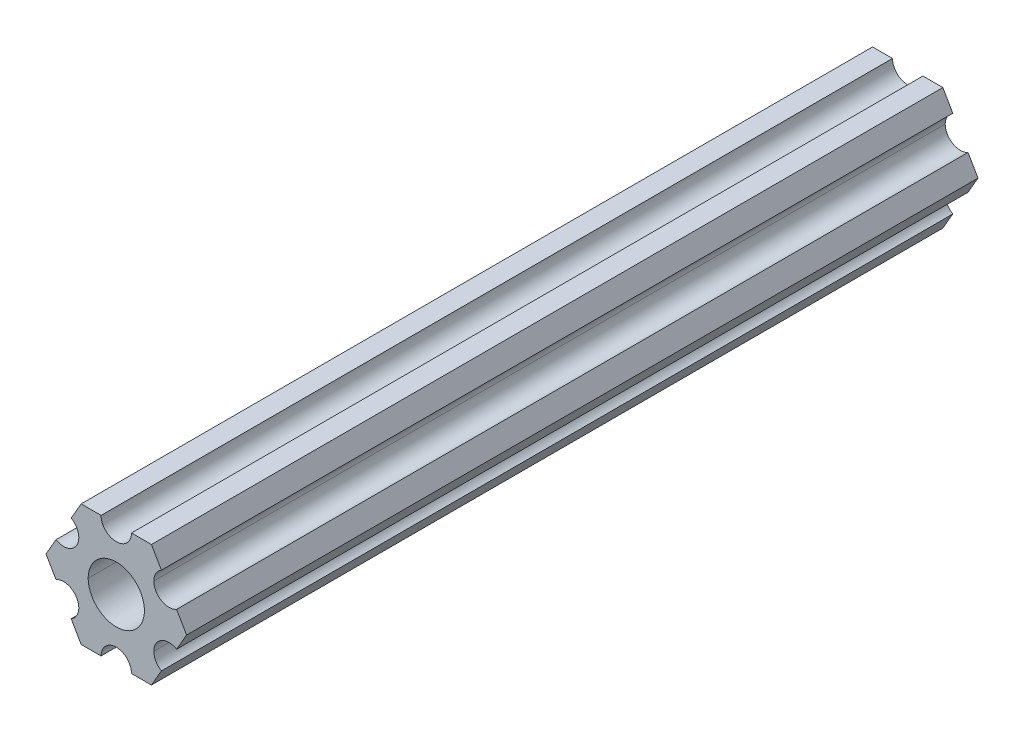
ISO-10303-21;
HEADER;
FILE_DESCRIPTION(('STEP AP214'),'2;1');
FILE_NAME('part.step','',(''),(''),'','','');
FILE_SCHEMA(('AUTOMOTIVE_DESIGN { 1 0 10303 214 1 1 1 1 }'));
ENDSEC;
DATA;
#1=APPLICATION_CONTEXT('core data for automotive mechanical design processes');
#2=APPLICATION_PROTOCOL_DEFINITION('international standard','automotive_design',2000,#1);
#3=PRODUCT_CONTEXT('',#1,'mechanical');
#4=PRODUCT('Part','Part','',(#3));
#5=PRODUCT_RELATED_PRODUCT_CATEGORY('part','',(#4));
#6=PRODUCT_DEFINITION_FORMATION('','',#4);
#7=PRODUCT_DEFINITION_CONTEXT('part definition',#1,'design');
#8=PRODUCT_DEFINITION('design','',#6,#7);
#9=PRODUCT_DEFINITION_SHAPE('','',#8);
#10=(LENGTH_UNIT() NAMED_UNIT(*) SI_UNIT(.MILLI.,.METRE.));
#11=(NAMED_UNIT(*) PLANE_ANGLE_UNIT() SI_UNIT($,.RADIAN.));
#12=(NAMED_UNIT(*) SI_UNIT($,.STERADIAN.) SOLID_ANGLE_UNIT());
#13=UNCERTAINTY_MEASURE_WITH_UNIT(LENGTH_MEASURE(1.E-05),#10,'distance_accuracy_value','');
#14=(GEOMETRIC_REPRESENTATION_CONTEXT(3) GLOBAL_UNCERTAINTY_ASSIGNED_CONTEXT((#13)) GLOBAL_UNIT_ASSIGNED_CONTEXT((#10,
#11,#12)) REPRESENTATION_CONTEXT('',''));
#15=CARTESIAN_POINT('',(0.,0.,0.));
#16=DIRECTION('',(0.,0.,1.));
#17=DIRECTION('',(1.,0.,0.));
#18=AXIS2_PLACEMENT_3D('',#15,#16,#17);
#19=CARTESIAN_POINT('',(6.29301142309098,-1.80018429024546,85.725));
#20=DIRECTION('',(-0.866025434075723,0.499999947533953,0.));
#21=DIRECTION('',(0.,0.,1.));
#22=AXIS2_PLACEMENT_3D('',#19,#20,#21);
#23=PLANE('',#22);
#24=DIRECTION('',(0.499999947533953,0.866025434075723,0.));
#25=VECTOR('',#24,1.);
#26=CARTESIAN_POINT('',(6.29301142309098,-1.80018429024546,82.55));
#27=LINE('',#26,#25);
#28=CARTESIAN_POINT('',(6.29301142309098,-1.80018429024546,82.55));
#29=VERTEX_POINT('',#28);
#30=CARTESIAN_POINT('',(7.33234841870826,4.44212519415746E-07,82.55));
#31=VERTEX_POINT('',#30);
#32=EDGE_CURVE('E398',#29,#31,#27,.T.);
#33=ORIENTED_EDGE('',*,*,#32,.F.);
#34=DIRECTION('',(0.,0.,-1.));
#35=VECTOR('',#34,1.);
#36=CARTESIAN_POINT('',(6.29301142309098,-1.80018429024546,85.725));
#37=LINE('',#36,#35);
#38=CARTESIAN_POINT('',(6.29301142309098,-1.80018429024546,0.));
#39=VERTEX_POINT('',#38);
#40=EDGE_CURVE('E270',#29,#39,#37,.T.);
#41=ORIENTED_EDGE('',*,*,#40,.T.);
#42=DIRECTION('',(0.499999947533953,0.866025434075723,0.));
#43=VECTOR('',#42,1.);
#44=CARTESIAN_POINT('',(6.29301142309098,-1.80018429024546,0.));
#45=LINE('',#44,#43);
#46=CARTESIAN_POINT('',(7.33234841870826,4.44212518961143E-07,0.));
#47=VERTEX_POINT('',#46);
#48=EDGE_CURVE('E292',#39,#47,#45,.T.);
#49=ORIENTED_EDGE('',*,*,#48,.T.);
#50=DIRECTION('',(0.,0.,1.));
#51=VECTOR('',#50,1.);
#52=CARTESIAN_POINT('',(7.33234841870827,4.44212519169686E-07,85.725));
#53=LINE('',#52,#51);
#54=EDGE_CURVE('E65',#47,#31,#53,.T.);
#55=ORIENTED_EDGE('',*,*,#54,.T.);
#56=EDGE_LOOP('',(#33,#41,#49,#55));
#57=FACE_BOUND('',#56,.T.);
#58=ADVANCED_FACE('F57',(#57),#23,.F.);
#59=CARTESIAN_POINT('',(7.33234841870827,4.44212519169686E-07,85.725));
#60=DIRECTION('',(-0.866025373493145,-0.500000052466057,0.));
#61=DIRECTION('',(-0.500000052466057,0.866025373493145,0.));
#62=AXIS2_PLACEMENT_3D('',#59,#60,#61);
#63=PLANE('',#62);
#64=DIRECTION('',(-0.500000052466057,0.866025373493145,0.));
#65=VECTOR('',#64,1.);
#66=CARTESIAN_POINT('',(7.33234841870827,4.44212519169686E-07,82.55));
#67=LINE('',#66,#65);
#68=CARTESIAN_POINT('',(6.29301120497139,1.80018505273895,82.55));
#69=VERTEX_POINT('',#68);
#70=EDGE_CURVE('E406',#31,#69,#67,.T.);
#71=ORIENTED_EDGE('',*,*,#70,.F.);
#72=ORIENTED_EDGE('',*,*,#54,.F.);
#73=DIRECTION('',(-0.500000052466057,0.866025373493145,0.));
#74=VECTOR('',#73,1.);
#75=CARTESIAN_POINT('',(7.33234841870827,4.44212519198906E-07,0.));
#76=LINE('',#75,#74);
#77=CARTESIAN_POINT('',(6.29301120497139,1.80018505273894,0.));
#78=VERTEX_POINT('',#77);
#79=EDGE_CURVE('E288',#47,#78,#76,.T.);
#80=ORIENTED_EDGE('',*,*,#79,.T.);
#81=DIRECTION('',(0.,0.,1.));
#82=VECTOR('',#81,1.);
#83=CARTESIAN_POINT('',(6.29301120497139,1.80018505273894,85.725));
#84=LINE('',#83,#82);
#85=EDGE_CURVE('E390',#78,#69,#84,.T.);
#86=ORIENTED_EDGE('',*,*,#85,.T.);
#87=EDGE_LOOP('',(#71,#72,#80,#86));
#88=FACE_BOUND('',#87,.T.);
#89=ADVANCED_FACE('F404',(#88),#63,.F.);
#90=CARTESIAN_POINT('',(5.49926112168156,3.17500033315934,85.725));
#91=DIRECTION('',(0.,0.,-1.));
#92=DIRECTION('',(-1.,0.,0.));
#93=AXIS2_PLACEMENT_3D('',#90,#91,#92);
#94=CYLINDRICAL_SURFACE('',#93,1.5875);
#95=CARTESIAN_POINT('',(5.49926112168156,3.17500033315934,82.55));
#96=DIRECTION('',(0.,0.,1.));
#97=DIRECTION('',(1.,0.,0.));
#98=AXIS2_PLACEMENT_3D('',#95,#96,#97);
#99=CIRCLE('',#98,1.5875);
#100=CARTESIAN_POINT('',(3.91176112168156,3.17500033315934,82.55));
#101=VERTEX_POINT('',#100);
#102=EDGE_CURVE('E409',#69,#101,#99,.F.);
#103=ORIENTED_EDGE('',*,*,#102,.F.);
#104=ORIENTED_EDGE('',*,*,#85,.F.);
#105=CARTESIAN_POINT('',(5.49926112168156,3.17500033315934,0.));
#106=DIRECTION('',(0.,0.,-1.));
#107=DIRECTION('',(-1.,0.,0.));
#108=AXIS2_PLACEMENT_3D('',#105,#106,#107);
#109=CIRCLE('',#108,1.5875);
#110=CARTESIAN_POINT('',(3.91176112168156,3.17500033315934,0.));
#111=VERTEX_POINT('',#110);
#112=EDGE_CURVE('E262',#78,#111,#109,.T.);
#113=ORIENTED_EDGE('',*,*,#112,.T.);
#114=DIRECTION('',(0.,0.,-1.));
#115=VECTOR('',#114,1.);
#116=CARTESIAN_POINT('',(3.91176112168156,3.17500033315934,85.725));
#117=LINE('',#116,#115);
#118=EDGE_CURVE('E273',#101,#111,#117,.T.);
#119=ORIENTED_EDGE('',*,*,#118,.F.);
#120=EDGE_LOOP('',(#103,#104,#113,#119));
#121=FACE_BOUND('',#120,.T.);
#122=ADVANCED_FACE('F869',(#121),#94,.F.);
#123=CARTESIAN_POINT('',(4.70551103839172,4.54981561357972,85.725));
#124=DIRECTION('',(-0.866025373493151,-0.500000052466046,0.));
#125=DIRECTION('',(-0.500000052466046,0.866025373493151,0.));
#126=AXIS2_PLACEMENT_3D('',#123,#124,#125);
#127=PLANE('',#126);
#128=DIRECTION('',(-0.500000052466046,0.866025373493151,0.));
#129=VECTOR('',#128,1.);
#130=CARTESIAN_POINT('',(4.70551103839172,4.54981561357972,82.55));
#131=LINE('',#130,#129);
#132=CARTESIAN_POINT('',(4.70551103839172,4.54981561357972,82.55));
#133=VERTEX_POINT('',#132);
#134=CARTESIAN_POINT('',(3.66617382465481,6.35000022210627,82.55));
#135=VERTEX_POINT('',#134);
#136=EDGE_CURVE('E479',#133,#135,#131,.T.);
#137=ORIENTED_EDGE('',*,*,#136,.F.);
#138=DIRECTION('',(0.,0.,1.));
#139=VECTOR('',#138,1.);
#140=CARTESIAN_POINT('',(4.70551103839172,4.54981561357972,85.725));
#141=LINE('',#140,#139);
#142=CARTESIAN_POINT('',(4.70551103839172,4.54981561357972,0.));
#143=VERTEX_POINT('',#142);
#144=EDGE_CURVE('E281',#143,#133,#141,.T.);
#145=ORIENTED_EDGE('',*,*,#144,.F.);
#146=DIRECTION('',(-0.500000052466046,0.866025373493151,0.));
#147=VECTOR('',#146,1.);
#148=CARTESIAN_POINT('',(4.70551103839172,4.54981561357972,0.));
#149=LINE('',#148,#147);
#150=CARTESIAN_POINT('',(3.66617382465481,6.35000022210627,0.));
#151=VERTEX_POINT('',#150);
#152=EDGE_CURVE('E259',#143,#151,#149,.T.);
#153=ORIENTED_EDGE('',*,*,#152,.T.);
#154=DIRECTION('',(0.,0.,1.));
#155=VECTOR('',#154,1.);
#156=CARTESIAN_POINT('',(3.66617382465481,6.35000022210627,85.725));
#157=LINE('',#156,#155);
#158=EDGE_CURVE('E386',#151,#135,#157,.T.);
#159=ORIENTED_EDGE('',*,*,#158,.T.);
#160=EDGE_LOOP('',(#137,#145,#153,#159));
#161=FACE_BOUND('',#160,.T.);
#162=ADVANCED_FACE('F491',(#161),#127,.F.);
#163=CARTESIAN_POINT('',(3.66617382465481,6.35000022210627,85.725));
#164=DIRECTION('',(6.05825850611185E-08,-1.,0.));
#165=DIRECTION('',(0.,0.,-1.));
#166=AXIS2_PLACEMENT_3D('',#163,#164,#165);
#167=PLANE('',#166);
#168=DIRECTION('',(-0.999999999999998,-6.05825850611184E-08,0.));
#169=VECTOR('',#168,1.);
#170=CARTESIAN_POINT('',(3.66617382465481,6.35000022210627,82.55));
#171=LINE('',#170,#169);
#172=CARTESIAN_POINT('',(1.58749961530074,6.35,82.55));
#173=VERTEX_POINT('',#172);
#174=EDGE_CURVE('E476',#135,#173,#171,.T.);
#175=ORIENTED_EDGE('',*,*,#174,.F.);
#176=ORIENTED_EDGE('',*,*,#158,.F.);
#177=DIRECTION('',(-1.,0.,0.));
#178=VECTOR('',#177,1.);
#179=CARTESIAN_POINT('',(5.49926112168156,6.35000022210627,0.));
#180=LINE('',#179,#178);
#181=CARTESIAN_POINT('',(1.58749961530073,6.35000015914054,0.));
#182=VERTEX_POINT('',#181);
#183=EDGE_CURVE('E263',#151,#182,#180,.T.);
#184=ORIENTED_EDGE('',*,*,#183,.T.);
#185=DIRECTION('',(0.,0.,1.));
#186=VECTOR('',#185,1.);
#187=CARTESIAN_POINT('',(1.58749961530074,6.35000009617482,85.725));
#188=LINE('',#187,#186);
#189=EDGE_CURVE('E303',#182,#173,#188,.T.);
#190=ORIENTED_EDGE('',*,*,#189,.T.);
#191=EDGE_LOOP('',(#175,#176,#184,#190));
#192=FACE_BOUND('',#191,.T.);
#193=ADVANCED_FACE('F498',(#192),#167,.F.);
#194=CARTESIAN_POINT('',(-3.84699260060323E-07,6.35,85.725));
#195=DIRECTION('',(0.,0.,-1.));
#196=DIRECTION('',(-1.,0.,0.));
#197=AXIS2_PLACEMENT_3D('',#194,#195,#196);
#198=CYLINDRICAL_SURFACE('',#197,1.5875);
#199=CARTESIAN_POINT('',(-3.84699260060323E-07,6.35,82.55));
#200=DIRECTION('',(0.,0.,1.));
#201=DIRECTION('',(1.,0.,0.));
#202=AXIS2_PLACEMENT_3D('',#199,#200,#201);
#203=CIRCLE('',#202,1.5875);
#204=CARTESIAN_POINT('',(-1.58750038469926,6.34999990382518,82.55));
#205=VERTEX_POINT('',#204);
#206=EDGE_CURVE('E473',#173,#205,#203,.F.);
#207=ORIENTED_EDGE('',*,*,#206,.F.);
#208=ORIENTED_EDGE('',*,*,#189,.F.);
#209=CARTESIAN_POINT('',(-3.84699260060323E-07,6.35,0.));
#210=DIRECTION('',(0.,0.,-1.));
#211=DIRECTION('',(-1.,0.,0.));
#212=AXIS2_PLACEMENT_3D('',#209,#210,#211);
#213=CIRCLE('',#212,1.5875);
#214=CARTESIAN_POINT('',(-1.58750038469926,6.34999990382519,0.));
#215=VERTEX_POINT('',#214);
#216=EDGE_CURVE('E329',#182,#215,#213,.T.);
#217=ORIENTED_EDGE('',*,*,#216,.T.);
#218=DIRECTION('',(0.,0.,1.));
#219=VECTOR('',#218,1.);
#220=CARTESIAN_POINT('',(-1.58750038469926,6.34999990382518,85.725));
#221=LINE('',#220,#219);
#222=EDGE_CURVE('E299',#215,#205,#221,.T.);
#223=ORIENTED_EDGE('',*,*,#222,.T.);
#224=EDGE_LOOP('',(#207,#208,#217,#223));
#225=FACE_BOUND('',#224,.T.);
#226=ADVANCED_FACE('F502',(#225),#198,.F.);
#227=CARTESIAN_POINT('',(-1.58750038469926,6.34999990382518,85.725));
#228=DIRECTION('',(6.05825963273174E-08,-1.,0.));
#229=DIRECTION('',(0.,0.,-1.));
#230=AXIS2_PLACEMENT_3D('',#227,#228,#229);
#231=PLANE('',#230);
#232=DIRECTION('',(-0.999999999999998,-6.05825963273173E-08,0.));
#233=VECTOR('',#232,1.);
#234=CARTESIAN_POINT('',(-1.58750038469926,6.34999990382518,82.55));
#235=LINE('',#234,#233);
#236=CARTESIAN_POINT('',(-3.66617454558244,6.34999986184803,82.55));
#237=VERTEX_POINT('',#236);
#238=EDGE_CURVE('E470',#205,#237,#235,.T.);
#239=ORIENTED_EDGE('',*,*,#238,.F.);
#240=ORIENTED_EDGE('',*,*,#222,.F.);
#241=DIRECTION('',(-1.,0.,0.));
#242=VECTOR('',#241,1.);
#243=CARTESIAN_POINT('',(5.49926112168156,6.34999990382519,0.));
#244=LINE('',#243,#242);
#245=CARTESIAN_POINT('',(-3.66617454558244,6.34999986184803,0.));
#246=VERTEX_POINT('',#245);
#247=EDGE_CURVE('E333',#215,#246,#244,.T.);
#248=ORIENTED_EDGE('',*,*,#247,.T.);
#249=DIRECTION('',(0.,0.,1.));
#250=VECTOR('',#249,1.);
#251=CARTESIAN_POINT('',(-3.66617459405349,6.3499997778937,85.725));
#252=LINE('',#251,#250);
#253=EDGE_CURVE('E286',#246,#237,#252,.T.);
#254=ORIENTED_EDGE('',*,*,#253,.T.);
#255=EDGE_LOOP('',(#239,#240,#248,#254));
#256=FACE_BOUND('',#255,.T.);
#257=ADVANCED_FACE('F504',(#256),#231,.F.);
#258=CARTESIAN_POINT('',(-3.66617459405349,6.3499997778937,85.725));
#259=DIRECTION('',(0.866025434075729,-0.499999947533942,0.));
#260=DIRECTION('',(0.,0.,-1.));
#261=AXIS2_PLACEMENT_3D('',#258,#259,#260);
#262=PLANE('',#261);
#263=DIRECTION('',(-0.499999947533942,-0.866025434075729,0.));
#264=VECTOR('',#263,1.);
#265=CARTESIAN_POINT('',(-3.66617459405349,6.3499997778937,82.55));
#266=LINE('',#265,#264);
#267=CARTESIAN_POINT('',(-4.70551158967065,4.54981504343587,82.55));
#268=VERTEX_POINT('',#267);
#269=EDGE_CURVE('E467',#237,#268,#266,.T.);
#270=ORIENTED_EDGE('',*,*,#269,.F.);
#271=ORIENTED_EDGE('',*,*,#253,.F.);
#272=DIRECTION('',(-0.499999947533943,-0.866025434075729,0.));
#273=VECTOR('',#272,1.);
#274=CARTESIAN_POINT('',(-3.66617459405349,6.3499997778937,0.));
#275=LINE('',#274,#273);
#276=CARTESIAN_POINT('',(-4.70551158967065,4.54981504343587,0.));
#277=VERTEX_POINT('',#276);
#278=EDGE_CURVE('E345',#246,#277,#275,.T.);
#279=ORIENTED_EDGE('',*,*,#278,.T.);
#280=DIRECTION('',(0.,0.,1.));
#281=VECTOR('',#280,1.);
#282=CARTESIAN_POINT('',(-4.70551158967065,4.54981504343587,85.725));
#283=LINE('',#282,#281);
#284=EDGE_CURVE('E282',#277,#268,#283,.T.);
#285=ORIENTED_EDGE('',*,*,#284,.T.);
#286=EDGE_LOOP('',(#270,#271,#279,#285));
#287=FACE_BOUND('',#286,.T.);
#288=ADVANCED_FACE('F509',(#287),#262,.F.);
#289=CARTESIAN_POINT('',(-5.49926150638082,3.17499966684067,85.725));
#290=DIRECTION('',(0.,0.,-1.));
#291=DIRECTION('',(-1.,0.,0.));
#292=AXIS2_PLACEMENT_3D('',#289,#290,#291);
#293=CYLINDRICAL_SURFACE('',#292,1.5875);
#294=CARTESIAN_POINT('',(-5.49926150638082,3.17499966684067,82.55));
#295=DIRECTION('',(0.,0.,1.));
#296=DIRECTION('',(1.,0.,0.));
#297=AXIS2_PLACEMENT_3D('',#294,#295,#296);
#298=CIRCLE('',#297,1.5875);
#299=CARTESIAN_POINT('',(-6.29301142309098,1.80018429024547,82.55));
#300=VERTEX_POINT('',#299);
#301=EDGE_CURVE('E464',#268,#300,#298,.F.);
#302=ORIENTED_EDGE('',*,*,#301,.F.);
#303=ORIENTED_EDGE('',*,*,#284,.F.);
#304=CARTESIAN_POINT('',(-5.49926150638082,3.17499966684067,0.));
#305=DIRECTION('',(0.,0.,-1.));
#306=DIRECTION('',(-1.,0.,0.));
#307=AXIS2_PLACEMENT_3D('',#304,#305,#306);
#308=CIRCLE('',#307,1.5875);
#309=CARTESIAN_POINT('',(-6.29301142309098,1.80018429024547,0.));
#310=VERTEX_POINT('',#309);
#311=EDGE_CURVE('E341',#277,#310,#308,.T.);
#312=ORIENTED_EDGE('',*,*,#311,.T.);
#313=DIRECTION('',(0.,0.,1.));
#314=VECTOR('',#313,1.);
#315=CARTESIAN_POINT('',(-6.29301142309098,1.80018429024547,85.725));
#316=LINE('',#315,#314);
#317=EDGE_CURVE('E287',#310,#300,#316,.T.);
#318=ORIENTED_EDGE('',*,*,#317,.T.);
#319=EDGE_LOOP('',(#302,#303,#312,#318));
#320=FACE_BOUND('',#319,.T.);
#321=ADVANCED_FACE('F512',(#320),#293,.F.);
#322=CARTESIAN_POINT('',(-6.29301142309098,1.80018429024547,85.725));
#323=DIRECTION('',(0.866025434075724,-0.499999947533952,0.));
#324=DIRECTION('',(0.,0.,-1.));
#325=AXIS2_PLACEMENT_3D('',#322,#323,#324);
#326=PLANE('',#325);
#327=DIRECTION('',(-0.499999947533952,-0.866025434075724,0.));
#328=VECTOR('',#327,1.);
#329=CARTESIAN_POINT('',(-6.29301142309098,1.80018429024547,82.55));
#330=LINE('',#329,#328);
#331=CARTESIAN_POINT('',(-7.33234841870827,-4.44212524036369E-07,82.55));
#332=VERTEX_POINT('',#331);
#333=EDGE_CURVE('E461',#300,#332,#330,.T.);
#334=ORIENTED_EDGE('',*,*,#333,.F.);
#335=ORIENTED_EDGE('',*,*,#317,.F.);
#336=DIRECTION('',(-0.499999947533952,-0.866025434075724,0.));
#337=VECTOR('',#336,1.);
#338=CARTESIAN_POINT('',(-6.29301142309098,1.80018429024547,0.));
#339=LINE('',#338,#337);
#340=CARTESIAN_POINT('',(-7.33234841870826,-4.44212524036367E-07,0.));
#341=VERTEX_POINT('',#340);
#342=EDGE_CURVE('E337',#310,#341,#339,.T.);
#343=ORIENTED_EDGE('',*,*,#342,.T.);
#344=DIRECTION('',(0.,0.,1.));
#345=VECTOR('',#344,1.);
#346=CARTESIAN_POINT('',(-7.33234841870827,-4.44212523790841E-07,85.725));
#347=LINE('',#346,#345);
#348=EDGE_CURVE('E269',#341,#332,#347,.T.);
#349=ORIENTED_EDGE('',*,*,#348,.T.);
#350=EDGE_LOOP('',(#334,#335,#343,#349));
#351=FACE_BOUND('',#350,.T.);
#352=ADVANCED_FACE('F517',(#351),#326,.F.);
#353=CARTESIAN_POINT('',(-7.33234841870827,-4.44212523790841E-07,85.725));
#354=DIRECTION('',(0.866025373493151,0.500000052466045,0.));
#355=DIRECTION('',(0.,0.,-1.));
#356=AXIS2_PLACEMENT_3D('',#353,#354,#355);
#357=PLANE('',#356);
#358=DIRECTION('',(0.500000052466045,-0.866025373493151,0.));
#359=VECTOR('',#358,1.);
#360=CARTESIAN_POINT('',(-7.33234841870827,-4.44212523790841E-07,82.55));
#361=LINE('',#360,#359);
#362=CARTESIAN_POINT('',(-6.29301120497141,-1.80018505273896,82.55));
#363=VERTEX_POINT('',#362);
#364=EDGE_CURVE('E458',#332,#363,#361,.T.);
#365=ORIENTED_EDGE('',*,*,#364,.F.);
#366=ORIENTED_EDGE('',*,*,#348,.F.);
#367=DIRECTION('',(0.500000052466045,-0.866025373493151,0.));
#368=VECTOR('',#367,1.);
#369=CARTESIAN_POINT('',(-7.33234841870827,-4.44212523969395E-07,0.));
#370=LINE('',#369,#368);
#371=CARTESIAN_POINT('',(-6.29301120497141,-1.80018505273897,0.));
#372=VERTEX_POINT('',#371);
#373=EDGE_CURVE('E308',#341,#372,#370,.T.);
#374=ORIENTED_EDGE('',*,*,#373,.T.);
#375=DIRECTION('',(0.,0.,1.));
#376=VECTOR('',#375,1.);
#377=CARTESIAN_POINT('',(-6.29301120497141,-1.80018505273897,85.725));
#378=LINE('',#377,#376);
#379=EDGE_CURVE('E265',#372,#363,#378,.T.);
#380=ORIENTED_EDGE('',*,*,#379,.T.);
#381=EDGE_LOOP('',(#365,#366,#374,#380));
#382=FACE_BOUND('',#381,.T.);
#383=ADVANCED_FACE('F520',(#382),#357,.F.);
#384=CARTESIAN_POINT('',(-5.49926112168156,-3.17500033315934,85.725));
#385=DIRECTION('',(0.,0.,-1.));
#386=DIRECTION('',(-1.,0.,0.));
#387=AXIS2_PLACEMENT_3D('',#384,#385,#386);
#388=CYLINDRICAL_SURFACE('',#387,1.5875);
#389=CARTESIAN_POINT('',(-5.49926112168156,-3.17500033315934,82.55));
#390=DIRECTION('',(0.,0.,1.));
#391=DIRECTION('',(1.,0.,0.));
#392=AXIS2_PLACEMENT_3D('',#389,#390,#391);
#393=CIRCLE('',#392,1.5875);
#394=CARTESIAN_POINT('',(-4.70551103839172,-4.54981561357972,82.55));
#395=VERTEX_POINT('',#394);
#396=EDGE_CURVE('E455',#363,#395,#393,.F.);
#397=ORIENTED_EDGE('',*,*,#396,.F.);
#398=ORIENTED_EDGE('',*,*,#379,.F.);
#399=CARTESIAN_POINT('',(-5.49926112168156,-3.17500033315934,0.));
#400=DIRECTION('',(0.,0.,-1.));
#401=DIRECTION('',(-1.,0.,0.));
#402=AXIS2_PLACEMENT_3D('',#399,#400,#401);
#403=CIRCLE('',#402,1.5875);
#404=CARTESIAN_POINT('',(-4.70551103839172,-4.54981561357972,0.));
#405=VERTEX_POINT('',#404);
#406=EDGE_CURVE('E304',#372,#405,#403,.T.);
#407=ORIENTED_EDGE('',*,*,#406,.T.);
#408=DIRECTION('',(0.,0.,1.));
#409=VECTOR('',#408,1.);
#410=CARTESIAN_POINT('',(-4.70551103839172,-4.54981561357972,85.725));
#411=LINE('',#410,#409);
#412=EDGE_CURVE('E252',#405,#395,#411,.T.);
#413=ORIENTED_EDGE('',*,*,#412,.T.);
#414=EDGE_LOOP('',(#397,#398,#407,#413));
#415=FACE_BOUND('',#414,.T.);
#416=ADVANCED_FACE('F526',(#415),#388,.F.);
#417=CARTESIAN_POINT('',(-4.70551103839172,-4.54981561357972,85.725));
#418=DIRECTION('',(0.866025373493152,0.500000052466045,0.));
#419=DIRECTION('',(0.,0.,-1.));
#420=AXIS2_PLACEMENT_3D('',#417,#418,#419);
#421=PLANE('',#420);
#422=DIRECTION('',(0.500000052466045,-0.866025373493152,0.));
#423=VECTOR('',#422,1.);
#424=CARTESIAN_POINT('',(-4.70551103839172,-4.54981561357972,82.55));
#425=LINE('',#424,#423);
#426=CARTESIAN_POINT('',(-3.66617382465481,-6.35000022210628,82.55));
#427=VERTEX_POINT('',#426);
#428=EDGE_CURVE('E452',#395,#427,#425,.T.);
#429=ORIENTED_EDGE('',*,*,#428,.F.);
#430=ORIENTED_EDGE('',*,*,#412,.F.);
#431=DIRECTION('',(0.500000052466045,-0.866025373493151,0.));
#432=VECTOR('',#431,1.);
#433=CARTESIAN_POINT('',(-4.70551103839172,-4.54981561357972,0.));
#434=LINE('',#433,#432);
#435=CARTESIAN_POINT('',(-3.66617382465481,-6.35000022210628,0.));
#436=VERTEX_POINT('',#435);
#437=EDGE_CURVE('E309',#405,#436,#434,.T.);
#438=ORIENTED_EDGE('',*,*,#437,.T.);
#439=DIRECTION('',(0.,0.,1.));
#440=VECTOR('',#439,1.);
#441=CARTESIAN_POINT('',(-3.66617382465481,-6.35000022210628,85.725));
#442=LINE('',#441,#440);
#443=EDGE_CURVE('E370',#436,#427,#442,.T.);
#444=ORIENTED_EDGE('',*,*,#443,.T.);
#445=EDGE_LOOP('',(#429,#430,#438,#444));
#446=FACE_BOUND('',#445,.T.);
#447=ADVANCED_FACE('F807',(#446),#421,.F.);
#448=CARTESIAN_POINT('',(-3.66617382465481,-6.35000022210628,85.725));
#449=DIRECTION('',(-6.05825854783851E-08,1.,0.));
#450=DIRECTION('',(0.,0.,1.));
#451=AXIS2_PLACEMENT_3D('',#448,#449,#450);
#452=PLANE('',#451);
#453=DIRECTION('',(0.999999999999998,6.0582585478385E-08,0.));
#454=VECTOR('',#453,1.);
#455=CARTESIAN_POINT('',(-3.66617382465481,-6.35000022210628,82.55));
#456=LINE('',#455,#454);
#457=CARTESIAN_POINT('',(-1.58749961530073,-6.35000011105314,82.55));
#458=VERTEX_POINT('',#457);
#459=EDGE_CURVE('E449',#427,#458,#456,.T.);
#460=ORIENTED_EDGE('',*,*,#459,.F.);
#461=ORIENTED_EDGE('',*,*,#443,.F.);
#462=DIRECTION('',(1.,0.,0.));
#463=VECTOR('',#462,1.);
#464=CARTESIAN_POINT('',(5.49926112168156,-6.35000022210628,0.));
#465=LINE('',#464,#463);
#466=CARTESIAN_POINT('',(-1.58749961530073,-6.35000011105314,0.));
#467=VERTEX_POINT('',#466);
#468=EDGE_CURVE('E322',#436,#467,#465,.T.);
#469=ORIENTED_EDGE('',*,*,#468,.T.);
#470=DIRECTION('',(0.,0.,1.));
#471=VECTOR('',#470,1.);
#472=CARTESIAN_POINT('',(-1.58749961530074,-6.35,85.725));
#473=LINE('',#472,#471);
#474=EDGE_CURVE('E369',#467,#458,#473,.T.);
#475=ORIENTED_EDGE('',*,*,#474,.T.);
#476=EDGE_LOOP('',(#460,#461,#469,#475));
#477=FACE_BOUND('',#476,.T.);
#478=ADVANCED_FACE('F799',(#477),#452,.F.);
#479=CARTESIAN_POINT('',(3.8469926204343E-07,-6.35,85.725));
#480=DIRECTION('',(0.,0.,-1.));
#481=DIRECTION('',(-1.,0.,0.));
#482=AXIS2_PLACEMENT_3D('',#479,#480,#481);
#483=CYLINDRICAL_SURFACE('',#482,1.5875);
#484=CARTESIAN_POINT('',(3.8469926204343E-07,-6.35,82.55));
#485=DIRECTION('',(0.,0.,1.));
#486=DIRECTION('',(1.,0.,0.));
#487=AXIS2_PLACEMENT_3D('',#484,#485,#486);
#488=CIRCLE('',#487,1.5875);
#489=CARTESIAN_POINT('',(1.58750038469926,-6.34999990382518,82.55));
#490=VERTEX_POINT('',#489);
#491=EDGE_CURVE('E446',#458,#490,#488,.F.);
#492=ORIENTED_EDGE('',*,*,#491,.F.);
#493=ORIENTED_EDGE('',*,*,#474,.F.);
#494=CARTESIAN_POINT('',(3.8469926204343E-07,-6.35,0.));
#495=DIRECTION('',(0.,0.,-1.));
#496=DIRECTION('',(-1.,0.,0.));
#497=AXIS2_PLACEMENT_3D('',#494,#495,#496);
#498=CIRCLE('',#497,1.5875);
#499=CARTESIAN_POINT('',(1.58750038469926,-6.34999990382519,0.));
#500=VERTEX_POINT('',#499);
#501=EDGE_CURVE('E257',#467,#500,#498,.T.);
#502=ORIENTED_EDGE('',*,*,#501,.T.);
#503=DIRECTION('',(0.,0.,1.));
#504=VECTOR('',#503,1.);
#505=CARTESIAN_POINT('',(1.58750038469926,-6.34999990382518,85.725));
#506=LINE('',#505,#504);
#507=EDGE_CURVE('E314',#500,#490,#506,.T.);
#508=ORIENTED_EDGE('',*,*,#507,.T.);
#509=EDGE_LOOP('',(#492,#493,#502,#508));
#510=FACE_BOUND('',#509,.T.);
#511=ADVANCED_FACE('F791',(#510),#483,.F.);
#512=CARTESIAN_POINT('',(1.58750038469926,-6.34999990382518,85.725));
#513=DIRECTION('',(-6.05825721258438E-08,1.,0.));
#514=DIRECTION('',(0.,0.,1.));
#515=AXIS2_PLACEMENT_3D('',#512,#513,#514);
#516=PLANE('',#515);
#517=DIRECTION('',(0.999999999999998,6.05825721258437E-08,0.));
#518=VECTOR('',#517,1.);
#519=CARTESIAN_POINT('',(1.58750038469926,-6.34999990382518,82.55));
#520=LINE('',#519,#518);
#521=CARTESIAN_POINT('',(3.66617454558243,-6.34999986184804,82.55));
#522=VERTEX_POINT('',#521);
#523=EDGE_CURVE('E443',#490,#522,#520,.T.);
#524=ORIENTED_EDGE('',*,*,#523,.F.);
#525=ORIENTED_EDGE('',*,*,#507,.F.);
#526=DIRECTION('',(1.,0.,0.));
#527=VECTOR('',#526,1.);
#528=CARTESIAN_POINT('',(5.49926112168156,-6.34999990382519,0.));
#529=LINE('',#528,#527);
#530=CARTESIAN_POINT('',(3.66617454558244,-6.34999986184804,0.));
#531=VERTEX_POINT('',#530);
#532=EDGE_CURVE('E253',#500,#531,#529,.T.);
#533=ORIENTED_EDGE('',*,*,#532,.T.);
#534=DIRECTION('',(0.,0.,1.));
#535=VECTOR('',#534,1.);
#536=CARTESIAN_POINT('',(3.66617459405346,-6.34999977789375,85.725));
#537=LINE('',#536,#535);
#538=EDGE_CURVE('E310',#531,#522,#537,.T.);
#539=ORIENTED_EDGE('',*,*,#538,.T.);
#540=EDGE_LOOP('',(#524,#525,#533,#539));
#541=FACE_BOUND('',#540,.T.);
#542=ADVANCED_FACE('F783',(#541),#516,.F.);
#543=CARTESIAN_POINT('',(3.66617459405346,-6.34999977789375,85.725));
#544=DIRECTION('',(-0.86602543407573,0.499999947533941,0.));
#545=DIRECTION('',(0.,0.,1.));
#546=AXIS2_PLACEMENT_3D('',#543,#544,#545);
#547=PLANE('',#546);
#548=DIRECTION('',(0.499999947533941,0.86602543407573,0.));
#549=VECTOR('',#548,1.);
#550=CARTESIAN_POINT('',(3.66617459405346,-6.34999977789375,82.55));
#551=LINE('',#550,#549);
#552=CARTESIAN_POINT('',(4.70551158967065,-4.54981504343587,82.55));
#553=VERTEX_POINT('',#552);
#554=EDGE_CURVE('E438',#522,#553,#551,.T.);
#555=ORIENTED_EDGE('',*,*,#554,.F.);
#556=ORIENTED_EDGE('',*,*,#538,.F.);
#557=DIRECTION('',(0.49999994753394,0.86602543407573,0.));
#558=VECTOR('',#557,1.);
#559=CARTESIAN_POINT('',(3.66617459405346,-6.34999977789376,0.));
#560=LINE('',#559,#558);
#561=CARTESIAN_POINT('',(4.70551158967065,-4.54981504343587,0.));
#562=VERTEX_POINT('',#561);
#563=EDGE_CURVE('E258',#531,#562,#560,.T.);
#564=ORIENTED_EDGE('',*,*,#563,.T.);
#565=DIRECTION('',(0.,0.,-1.));
#566=VECTOR('',#565,1.);
#567=CARTESIAN_POINT('',(4.70551158967065,-4.54981504343587,85.725));
#568=LINE('',#567,#566);
#569=EDGE_CURVE('E315',#553,#562,#568,.T.);
#570=ORIENTED_EDGE('',*,*,#569,.F.);
#571=EDGE_LOOP('',(#555,#556,#564,#570));
#572=FACE_BOUND('',#571,.T.);
#573=ADVANCED_FACE('F777',(#572),#547,.F.);
#574=CARTESIAN_POINT('',(5.49926150638082,-3.17499966684067,85.725));
#575=DIRECTION('',(0.,0.,-1.));
#576=DIRECTION('',(-1.,0.,0.));
#577=AXIS2_PLACEMENT_3D('',#574,#575,#576);
#578=CYLINDRICAL_SURFACE('',#577,1.5875);
#579=CARTESIAN_POINT('',(5.49926150638082,-3.17499966684067,82.55));
#580=DIRECTION('',(0.,0.,1.));
#581=DIRECTION('',(1.,0.,0.));
#582=AXIS2_PLACEMENT_3D('',#579,#580,#581);
#583=CIRCLE('',#582,1.5875);
#584=CARTESIAN_POINT('',(3.91176150638082,-3.17499966684067,82.55));
#585=VERTEX_POINT('',#584);
#586=EDGE_CURVE('E72',#553,#585,#583,.F.);
#587=ORIENTED_EDGE('',*,*,#586,.F.);
#588=ORIENTED_EDGE('',*,*,#569,.T.);
#589=CARTESIAN_POINT('',(5.49926150638082,-3.17499966684067,0.));
#590=DIRECTION('',(0.,0.,-1.));
#591=DIRECTION('',(-1.,0.,0.));
#592=AXIS2_PLACEMENT_3D('',#589,#590,#591);
#593=CIRCLE('',#592,1.5875);
#594=CARTESIAN_POINT('',(3.91176150638082,-3.17499966684067,0.));
#595=VERTEX_POINT('',#594);
#596=EDGE_CURVE('E280',#562,#595,#593,.T.);
#597=ORIENTED_EDGE('',*,*,#596,.T.);
#598=DIRECTION('',(0.,0.,-1.));
#599=VECTOR('',#598,1.);
#600=CARTESIAN_POINT('',(3.91176150638082,-3.17499966684067,85.725));
#601=LINE('',#600,#599);
#602=EDGE_CURVE('E242',#585,#595,#601,.T.);
#603=ORIENTED_EDGE('',*,*,#602,.F.);
#604=EDGE_LOOP('',(#587,#588,#597,#603));
#605=FACE_BOUND('',#604,.T.);
#606=ADVANCED_FACE('F428',(#605),#578,.F.);
#607=CARTESIAN_POINT('',(0.,0.,85.725));
#608=DIRECTION('',(0.,0.,-1.));
#609=DIRECTION('',(-1.,0.,0.));
#610=AXIS2_PLACEMENT_3D('',#607,#608,#609);
#611=CYLINDRICAL_SURFACE('',#610,2.9337);
#612=CARTESIAN_POINT('',(0.,0.,82.55));
#613=DIRECTION('',(0.,0.,1.));
#614=DIRECTION('',(1.,0.,0.));
#615=AXIS2_PLACEMENT_3D('',#612,#613,#614);
#616=CIRCLE('',#615,2.9337);
#617=CARTESIAN_POINT('',(-2.9337,0.,82.55));
#618=VERTEX_POINT('',#617);
#619=CARTESIAN_POINT('',(2.9337,0.,82.55));
#620=VERTEX_POINT('',#619);
#621=EDGE_CURVE('E78',#618,#620,#616,.F.);
#622=ORIENTED_EDGE('',*,*,#621,.F.);
#623=DIRECTION('',(0.,0.,-1.));
#624=VECTOR('',#623,1.);
#625=CARTESIAN_POINT('',(-2.9337,0.,85.725));
#626=LINE('',#625,#624);
#627=CARTESIAN_POINT('',(-2.9337,0.,0.));
#628=VERTEX_POINT('',#627);
#629=EDGE_CURVE('E231',#618,#628,#626,.T.);
#630=ORIENTED_EDGE('',*,*,#629,.T.);
#631=CARTESIAN_POINT('',(0.,0.,0.));
#632=DIRECTION('',(0.,0.,1.));
#633=DIRECTION('',(-1.,0.,0.));
#634=AXIS2_PLACEMENT_3D('',#631,#632,#633);
#635=CIRCLE('',#634,2.9337);
#636=CARTESIAN_POINT('',(2.9337,0.,0.));
#637=VERTEX_POINT('',#636);
#638=EDGE_CURVE('E277',#637,#628,#635,.T.);
#639=ORIENTED_EDGE('',*,*,#638,.F.);
#640=DIRECTION('',(0.,0.,-1.));
#641=VECTOR('',#640,1.);
#642=CARTESIAN_POINT('',(2.9337,0.,85.725));
#643=LINE('',#642,#641);
#644=EDGE_CURVE('E233',#620,#637,#643,.T.);
#645=ORIENTED_EDGE('',*,*,#644,.F.);
#646=EDGE_LOOP('',(#622,#630,#639,#645));
#647=FACE_BOUND('',#646,.T.);
#648=ADVANCED_FACE('F229',(#647),#611,.F.);
#649=CARTESIAN_POINT('',(5.49926112168156,3.17500033315934,85.725));
#650=DIRECTION('',(0.,0.,-1.));
#651=DIRECTION('',(-1.,0.,0.));
#652=AXIS2_PLACEMENT_3D('',#649,#650,#651);
#653=CYLINDRICAL_SURFACE('',#652,1.5875);
#654=CARTESIAN_POINT('',(5.49926112168156,3.17500033315934,82.55));
#655=DIRECTION('',(0.,0.,1.));
#656=DIRECTION('',(1.,0.,0.));
#657=AXIS2_PLACEMENT_3D('',#654,#655,#656);
#658=CIRCLE('',#657,1.5875);
#659=EDGE_CURVE('E414',#101,#133,#658,.F.);
#660=ORIENTED_EDGE('',*,*,#659,.F.);
#661=ORIENTED_EDGE('',*,*,#118,.T.);
#662=CARTESIAN_POINT('',(5.49926112168156,3.17500033315934,0.));
#663=DIRECTION('',(0.,0.,-1.));
#664=DIRECTION('',(-1.,0.,0.));
#665=AXIS2_PLACEMENT_3D('',#662,#663,#664);
#666=CIRCLE('',#665,1.5875);
#667=EDGE_CURVE('E276',#111,#143,#666,.T.);
#668=ORIENTED_EDGE('',*,*,#667,.T.);
#669=ORIENTED_EDGE('',*,*,#144,.T.);
#670=EDGE_LOOP('',(#660,#661,#668,#669));
#671=FACE_BOUND('',#670,.T.);
#672=ADVANCED_FACE('F492',(#671),#653,.F.);
#673=CARTESIAN_POINT('',(5.49926150638082,-3.17499966684067,85.725));
#674=DIRECTION('',(0.,0.,-1.));
#675=DIRECTION('',(-1.,0.,0.));
#676=AXIS2_PLACEMENT_3D('',#673,#674,#675);
#677=CYLINDRICAL_SURFACE('',#676,1.5875);
#678=CARTESIAN_POINT('',(5.49926150638082,-3.17499966684067,82.55));
#679=DIRECTION('',(0.,0.,1.));
#680=DIRECTION('',(1.,0.,0.));
#681=AXIS2_PLACEMENT_3D('',#678,#679,#680);
#682=CIRCLE('',#681,1.5875);
#683=EDGE_CURVE('E235',#585,#29,#682,.F.);
#684=ORIENTED_EDGE('',*,*,#683,.F.);
#685=ORIENTED_EDGE('',*,*,#602,.T.);
#686=CARTESIAN_POINT('',(5.49926150638082,-3.17499966684067,0.));
#687=DIRECTION('',(0.,0.,-1.));
#688=DIRECTION('',(-1.,0.,0.));
#689=AXIS2_PLACEMENT_3D('',#686,#687,#688);
#690=CIRCLE('',#689,1.5875);
#691=EDGE_CURVE('E247',#595,#39,#690,.T.);
#692=ORIENTED_EDGE('',*,*,#691,.T.);
#693=ORIENTED_EDGE('',*,*,#40,.F.);
#694=EDGE_LOOP('',(#684,#685,#692,#693));
#695=FACE_BOUND('',#694,.T.);
#696=ADVANCED_FACE('F434',(#695),#677,.F.);
#697=CARTESIAN_POINT('',(0.,0.,85.725));
#698=DIRECTION('',(0.,0.,-1.));
#699=DIRECTION('',(-1.,0.,0.));
#700=AXIS2_PLACEMENT_3D('',#697,#698,#699);
#701=CYLINDRICAL_SURFACE('',#700,2.9337);
#702=CARTESIAN_POINT('',(0.,0.,82.55));
#703=DIRECTION('',(0.,0.,1.));
#704=DIRECTION('',(1.,0.,0.));
#705=AXIS2_PLACEMENT_3D('',#702,#703,#704);
#706=CIRCLE('',#705,2.9337);
#707=EDGE_CURVE('E12',#620,#618,#706,.F.);
#708=ORIENTED_EDGE('',*,*,#707,.F.);
#709=ORIENTED_EDGE('',*,*,#644,.T.);
#710=CARTESIAN_POINT('',(0.,0.,0.));
#711=DIRECTION('',(0.,0.,1.));
#712=DIRECTION('',(-1.,0.,0.));
#713=AXIS2_PLACEMENT_3D('',#710,#711,#712);
#714=CIRCLE('',#713,2.9337);
#715=EDGE_CURVE('E240',#628,#637,#714,.T.);
#716=ORIENTED_EDGE('',*,*,#715,.F.);
#717=ORIENTED_EDGE('',*,*,#629,.F.);
#718=EDGE_LOOP('',(#708,#709,#716,#717));
#719=FACE_BOUND('',#718,.T.);
#720=ADVANCED_FACE('F238',(#719),#701,.F.);
#721=CARTESIAN_POINT('',(5.49926112168156,3.17500033315934,0.));
#722=DIRECTION('',(0.,0.,1.));
#723=DIRECTION('',(1.,0.,0.));
#724=AXIS2_PLACEMENT_3D('',#721,#722,#723);
#725=PLANE('',#724);
#726=ORIENTED_EDGE('',*,*,#715,.T.);
#727=ORIENTED_EDGE('',*,*,#638,.T.);
#728=EDGE_LOOP('',(#726,#727));
#729=FACE_BOUND('',#728,.T.);
#730=ORIENTED_EDGE('',*,*,#596,.F.);
#731=ORIENTED_EDGE('',*,*,#563,.F.);
#732=ORIENTED_EDGE('',*,*,#532,.F.);
#733=ORIENTED_EDGE('',*,*,#501,.F.);
#734=ORIENTED_EDGE('',*,*,#468,.F.);
#735=ORIENTED_EDGE('',*,*,#437,.F.);
#736=ORIENTED_EDGE('',*,*,#406,.F.);
#737=ORIENTED_EDGE('',*,*,#373,.F.);
#738=ORIENTED_EDGE('',*,*,#342,.F.);
#739=ORIENTED_EDGE('',*,*,#311,.F.);
#740=ORIENTED_EDGE('',*,*,#278,.F.);
#741=ORIENTED_EDGE('',*,*,#247,.F.);
#742=ORIENTED_EDGE('',*,*,#216,.F.);
#743=ORIENTED_EDGE('',*,*,#183,.F.);
#744=ORIENTED_EDGE('',*,*,#152,.F.);
#745=ORIENTED_EDGE('',*,*,#667,.F.);
#746=ORIENTED_EDGE('',*,*,#112,.F.);
#747=ORIENTED_EDGE('',*,*,#79,.F.);
#748=ORIENTED_EDGE('',*,*,#48,.F.);
#749=ORIENTED_EDGE('',*,*,#691,.F.);
#750=EDGE_LOOP('',(#730,#731,#732,#733,#734,#735,#736,#737,#738,#739,#740,#741,#742,#743,#744,
#745,#746,#747,#748,#749));
#751=FACE_BOUND('',#750,.T.);
#752=ADVANCED_FACE('F432',(#729,#751),#725,.F.);
#753=CARTESIAN_POINT('',(5.49926112168156,3.17500033315934,82.55));
#754=DIRECTION('',(0.,0.,1.));
#755=DIRECTION('',(1.,0.,0.));
#756=AXIS2_PLACEMENT_3D('',#753,#754,#755);
#757=PLANE('',#756);
#758=ORIENTED_EDGE('',*,*,#621,.T.);
#759=ORIENTED_EDGE('',*,*,#707,.T.);
#760=EDGE_LOOP('',(#758,#759));
#761=FACE_BOUND('',#760,.T.);
#762=ORIENTED_EDGE('',*,*,#70,.T.);
#763=ORIENTED_EDGE('',*,*,#102,.T.);
#764=ORIENTED_EDGE('',*,*,#659,.T.);
#765=ORIENTED_EDGE('',*,*,#136,.T.);
#766=ORIENTED_EDGE('',*,*,#174,.T.);
#767=ORIENTED_EDGE('',*,*,#206,.T.);
#768=ORIENTED_EDGE('',*,*,#238,.T.);
#769=ORIENTED_EDGE('',*,*,#269,.T.);
#770=ORIENTED_EDGE('',*,*,#301,.T.);
#771=ORIENTED_EDGE('',*,*,#333,.T.);
#772=ORIENTED_EDGE('',*,*,#364,.T.);
#773=ORIENTED_EDGE('',*,*,#396,.T.);
#774=ORIENTED_EDGE('',*,*,#428,.T.);
#775=ORIENTED_EDGE('',*,*,#459,.T.);
#776=ORIENTED_EDGE('',*,*,#491,.T.);
#777=ORIENTED_EDGE('',*,*,#523,.T.);
#778=ORIENTED_EDGE('',*,*,#554,.T.);
#779=ORIENTED_EDGE('',*,*,#586,.T.);
#780=ORIENTED_EDGE('',*,*,#683,.T.);
#781=ORIENTED_EDGE('',*,*,#32,.T.);
#782=EDGE_LOOP('',(#762,#763,#764,#765,#766,#767,#768,#769,#770,#771,#772,#773,#774,#775,#776,
#777,#778,#779,#780,#781));
#783=FACE_BOUND('',#782,.T.);
#784=ADVANCED_FACE('F224',(#761,#783),#757,.T.);
#785=CLOSED_SHELL('',(#58,#89,#122,#162,#193,#226,#257,#288,#321,#352,#383,#416,#447,#478,#511,
#542,#573,#606,#648,#672,#696,#720,#752,#784));
#786=MANIFOLD_SOLID_BREP('B2',#785);
#787=ADVANCED_BREP_SHAPE_REPRESENTATION('',(#18,#786),#14);
#788=SHAPE_DEFINITION_REPRESENTATION(#9,#787);
ENDSEC;
END-ISO-10303-21;
